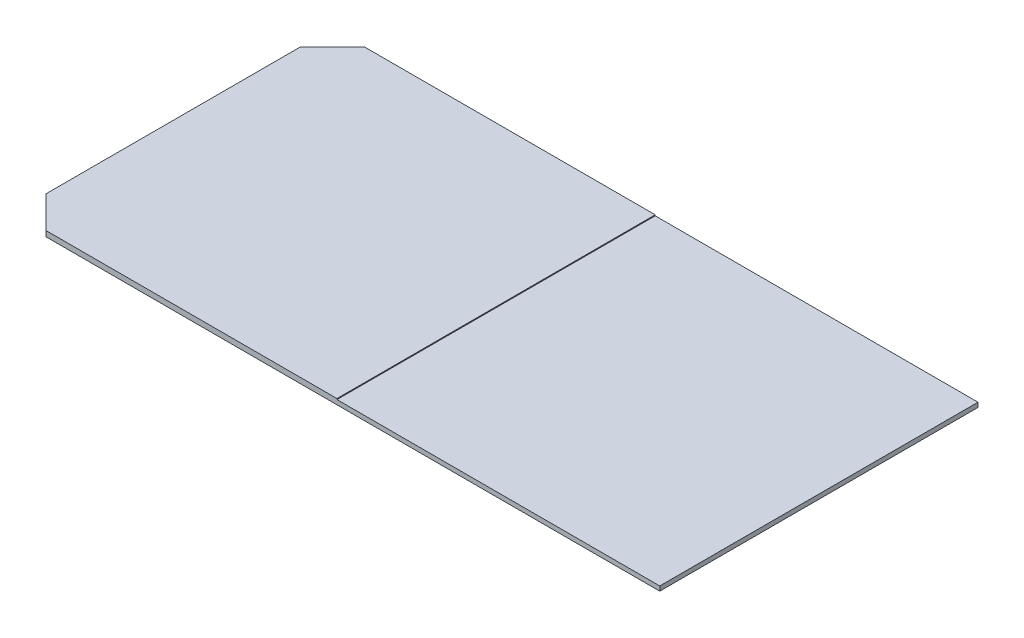
ISO-10303-21;
HEADER;
FILE_DESCRIPTION(('STEP AP214'),'2;1');
FILE_NAME('part.step','',(''),(''),'','','');
FILE_SCHEMA(('AUTOMOTIVE_DESIGN { 1 0 10303 214 1 1 1 1 }'));
ENDSEC;
DATA;
#1=APPLICATION_CONTEXT('core data for automotive mechanical design processes');
#2=APPLICATION_PROTOCOL_DEFINITION('international standard','automotive_design',2000,#1);
#3=PRODUCT_CONTEXT('',#1,'mechanical');
#4=PRODUCT('Part','Part','',(#3));
#5=PRODUCT_RELATED_PRODUCT_CATEGORY('part','',(#4));
#6=PRODUCT_DEFINITION_FORMATION('','',#4);
#7=PRODUCT_DEFINITION_CONTEXT('part definition',#1,'design');
#8=PRODUCT_DEFINITION('design','',#6,#7);
#9=PRODUCT_DEFINITION_SHAPE('','',#8);
#10=(LENGTH_UNIT() NAMED_UNIT(*) SI_UNIT(.MILLI.,.METRE.));
#11=(NAMED_UNIT(*) PLANE_ANGLE_UNIT() SI_UNIT($,.RADIAN.));
#12=(NAMED_UNIT(*) SI_UNIT($,.STERADIAN.) SOLID_ANGLE_UNIT());
#13=UNCERTAINTY_MEASURE_WITH_UNIT(LENGTH_MEASURE(1.E-05),#10,'distance_accuracy_value','');
#14=(GEOMETRIC_REPRESENTATION_CONTEXT(3) GLOBAL_UNCERTAINTY_ASSIGNED_CONTEXT((#13)) GLOBAL_UNIT_ASSIGNED_CONTEXT((#10,
#11,#12)) REPRESENTATION_CONTEXT('',''));
#15=CARTESIAN_POINT('',(0.,0.,0.));
#16=DIRECTION('',(0.,0.,1.));
#17=DIRECTION('',(1.,0.,0.));
#18=AXIS2_PLACEMENT_3D('',#15,#16,#17);
#19=CARTESIAN_POINT('',(0.,5.,0.));
#20=DIRECTION('',(1.,0.,0.));
#21=DIRECTION('',(0.,0.,-1.));
#22=AXIS2_PLACEMENT_3D('',#19,#20,#21);
#23=PLANE('',#22);
#24=DIRECTION('',(0.,0.,1.));
#25=VECTOR('',#24,1.);
#26=CARTESIAN_POINT('',(0.,6.,0.));
#27=LINE('',#26,#25);
#28=CARTESIAN_POINT('',(0.,6.,-315.));
#29=VERTEX_POINT('',#28);
#30=CARTESIAN_POINT('',(0.,6.,-35.));
#31=VERTEX_POINT('',#30);
#32=EDGE_CURVE('E119',#29,#31,#27,.T.);
#33=ORIENTED_EDGE('',*,*,#32,.F.);
#34=DIRECTION('',(0.,1.,0.));
#35=VECTOR('',#34,1.);
#36=CARTESIAN_POINT('',(0.,0.,-315.));
#37=LINE('',#36,#35);
#38=CARTESIAN_POINT('',(0.,0.,-315.));
#39=VERTEX_POINT('',#38);
#40=EDGE_CURVE('E63',#39,#29,#37,.T.);
#41=ORIENTED_EDGE('',*,*,#40,.F.);
#42=DIRECTION('',(0.,0.,1.));
#43=VECTOR('',#42,1.);
#44=CARTESIAN_POINT('',(0.,0.,0.));
#45=LINE('',#44,#43);
#46=CARTESIAN_POINT('',(0.,0.,-35.));
#47=VERTEX_POINT('',#46);
#48=EDGE_CURVE('E117',#39,#47,#45,.T.);
#49=ORIENTED_EDGE('',*,*,#48,.T.);
#50=DIRECTION('',(0.,1.,0.));
#51=VECTOR('',#50,1.);
#52=CARTESIAN_POINT('',(0.,0.,-35.));
#53=LINE('',#52,#51);
#54=EDGE_CURVE('E162',#47,#31,#53,.T.);
#55=ORIENTED_EDGE('',*,*,#54,.T.);
#56=EDGE_LOOP('',(#33,#41,#49,#55));
#57=FACE_BOUND('',#56,.T.);
#58=ADVANCED_FACE('F41',(#57),#23,.F.);
#59=CARTESIAN_POINT('',(0.,5.,0.));
#60=DIRECTION('',(0.,0.,-1.));
#61=DIRECTION('',(-1.,0.,0.));
#62=AXIS2_PLACEMENT_3D('',#59,#60,#61);
#63=PLANE('',#62);
#64=DIRECTION('',(0.,1.,0.));
#65=VECTOR('',#64,1.);
#66=CARTESIAN_POINT('',(34.9999999999997,0.,0.));
#67=LINE('',#66,#65);
#68=CARTESIAN_POINT('',(34.9999999999997,0.,0.));
#69=VERTEX_POINT('',#68);
#70=CARTESIAN_POINT('',(34.9999999999997,6.,0.));
#71=VERTEX_POINT('',#70);
#72=EDGE_CURVE('E55',#69,#71,#67,.T.);
#73=ORIENTED_EDGE('',*,*,#72,.F.);
#74=DIRECTION('',(1.,0.,0.));
#75=VECTOR('',#74,1.);
#76=CARTESIAN_POINT('',(0.,0.,0.));
#77=LINE('',#76,#75);
#78=CARTESIAN_POINT('',(710.,0.,0.));
#79=VERTEX_POINT('',#78);
#80=EDGE_CURVE('E125',#69,#79,#77,.T.);
#81=ORIENTED_EDGE('',*,*,#80,.T.);
#82=DIRECTION('',(0.,-1.,0.));
#83=VECTOR('',#82,1.);
#84=CARTESIAN_POINT('',(710.,5.,0.));
#85=LINE('',#84,#83);
#86=CARTESIAN_POINT('',(710.,5.,0.));
#87=VERTEX_POINT('',#86);
#88=EDGE_CURVE('E11',#87,#79,#85,.T.);
#89=ORIENTED_EDGE('',*,*,#88,.F.);
#90=DIRECTION('',(1.,0.,0.));
#91=VECTOR('',#90,1.);
#92=CARTESIAN_POINT('',(0.,5.,0.));
#93=LINE('',#92,#91);
#94=CARTESIAN_POINT('',(355.,5.,0.));
#95=VERTEX_POINT('',#94);
#96=EDGE_CURVE('E138',#95,#87,#93,.T.);
#97=ORIENTED_EDGE('',*,*,#96,.F.);
#98=DIRECTION('',(0.,-1.,0.));
#99=VECTOR('',#98,1.);
#100=CARTESIAN_POINT('',(355.,6.,0.));
#101=LINE('',#100,#99);
#102=CARTESIAN_POINT('',(355.,6.,0.));
#103=VERTEX_POINT('',#102);
#104=EDGE_CURVE('E130',#103,#95,#101,.T.);
#105=ORIENTED_EDGE('',*,*,#104,.F.);
#106=DIRECTION('',(1.,0.,0.));
#107=VECTOR('',#106,1.);
#108=CARTESIAN_POINT('',(0.,6.,0.));
#109=LINE('',#108,#107);
#110=EDGE_CURVE('E151',#71,#103,#109,.T.);
#111=ORIENTED_EDGE('',*,*,#110,.F.);
#112=EDGE_LOOP('',(#73,#81,#89,#97,#105,#111));
#113=FACE_BOUND('',#112,.T.);
#114=ADVANCED_FACE('F183',(#113),#63,.F.);
#115=CARTESIAN_POINT('',(0.,0.,0.));
#116=DIRECTION('',(0.,-1.,0.));
#117=DIRECTION('',(0.,0.,-1.));
#118=AXIS2_PLACEMENT_3D('',#115,#116,#117);
#119=PLANE('',#118);
#120=DIRECTION('',(0.707106781186544,0.,-0.707106781186551));
#121=VECTOR('',#120,1.);
#122=CARTESIAN_POINT('',(-157.5,0.,-157.499999999998));
#123=LINE('',#122,#121);
#124=CARTESIAN_POINT('',(34.9999999999996,0.,-350.));
#125=VERTEX_POINT('',#124);
#126=EDGE_CURVE('E103',#39,#125,#123,.T.);
#127=ORIENTED_EDGE('',*,*,#126,.T.);
#128=DIRECTION('',(-1.,0.,0.));
#129=VECTOR('',#128,1.);
#130=CARTESIAN_POINT('',(0.,0.,-350.));
#131=LINE('',#130,#129);
#132=CARTESIAN_POINT('',(710.,0.,-350.));
#133=VERTEX_POINT('',#132);
#134=EDGE_CURVE('E137',#133,#125,#131,.T.);
#135=ORIENTED_EDGE('',*,*,#134,.F.);
#136=DIRECTION('',(0.,0.,-1.));
#137=VECTOR('',#136,1.);
#138=CARTESIAN_POINT('',(710.,0.,0.));
#139=LINE('',#138,#137);
#140=EDGE_CURVE('E128',#79,#133,#139,.T.);
#141=ORIENTED_EDGE('',*,*,#140,.F.);
#142=ORIENTED_EDGE('',*,*,#80,.F.);
#143=DIRECTION('',(0.707106781186544,0.,0.707106781186551));
#144=VECTOR('',#143,1.);
#145=CARTESIAN_POINT('',(17.5,0.,-17.4999999999998));
#146=LINE('',#145,#144);
#147=EDGE_CURVE('E124',#47,#69,#146,.T.);
#148=ORIENTED_EDGE('',*,*,#147,.F.);
#149=ORIENTED_EDGE('',*,*,#48,.F.);
#150=EDGE_LOOP('',(#127,#135,#141,#142,#148,#149));
#151=FACE_BOUND('',#150,.T.);
#152=ADVANCED_FACE('F122',(#151),#119,.T.);
#153=CARTESIAN_POINT('',(0.,6.,0.));
#154=DIRECTION('',(0.,1.,0.));
#155=DIRECTION('',(0.,0.,1.));
#156=AXIS2_PLACEMENT_3D('',#153,#154,#155);
#157=PLANE('',#156);
#158=DIRECTION('',(0.707106781186544,0.,-0.707106781186551));
#159=VECTOR('',#158,1.);
#160=CARTESIAN_POINT('',(-157.5,6.,-157.499999999998));
#161=LINE('',#160,#159);
#162=CARTESIAN_POINT('',(34.9999999999996,6.,-350.));
#163=VERTEX_POINT('',#162);
#164=EDGE_CURVE('E111',#29,#163,#161,.T.);
#165=ORIENTED_EDGE('',*,*,#164,.F.);
#166=ORIENTED_EDGE('',*,*,#32,.T.);
#167=DIRECTION('',(0.707106781186544,0.,0.707106781186551));
#168=VECTOR('',#167,1.);
#169=CARTESIAN_POINT('',(17.5,6.,-17.4999999999998));
#170=LINE('',#169,#168);
#171=EDGE_CURVE('E165',#31,#71,#170,.T.);
#172=ORIENTED_EDGE('',*,*,#171,.T.);
#173=ORIENTED_EDGE('',*,*,#110,.T.);
#174=DIRECTION('',(0.,0.,1.));
#175=VECTOR('',#174,1.);
#176=CARTESIAN_POINT('',(355.,6.,0.));
#177=LINE('',#176,#175);
#178=CARTESIAN_POINT('',(355.,6.,-350.));
#179=VERTEX_POINT('',#178);
#180=EDGE_CURVE('E154',#179,#103,#177,.T.);
#181=ORIENTED_EDGE('',*,*,#180,.F.);
#182=DIRECTION('',(-1.,0.,0.));
#183=VECTOR('',#182,1.);
#184=CARTESIAN_POINT('',(0.,6.,-350.));
#185=LINE('',#184,#183);
#186=EDGE_CURVE('E157',#179,#163,#185,.T.);
#187=ORIENTED_EDGE('',*,*,#186,.T.);
#188=EDGE_LOOP('',(#165,#166,#172,#173,#181,#187));
#189=FACE_BOUND('',#188,.T.);
#190=ADVANCED_FACE('F173',(#189),#157,.T.);
#191=CARTESIAN_POINT('',(710.,5.,0.));
#192=DIRECTION('',(-1.,0.,0.));
#193=DIRECTION('',(0.,0.,1.));
#194=AXIS2_PLACEMENT_3D('',#191,#192,#193);
#195=PLANE('',#194);
#196=ORIENTED_EDGE('',*,*,#140,.T.);
#197=DIRECTION('',(0.,-1.,0.));
#198=VECTOR('',#197,1.);
#199=CARTESIAN_POINT('',(710.,5.,-350.));
#200=LINE('',#199,#198);
#201=CARTESIAN_POINT('',(710.,5.,-350.));
#202=VERTEX_POINT('',#201);
#203=EDGE_CURVE('E48',#202,#133,#200,.T.);
#204=ORIENTED_EDGE('',*,*,#203,.F.);
#205=DIRECTION('',(0.,0.,-1.));
#206=VECTOR('',#205,1.);
#207=CARTESIAN_POINT('',(710.,5.,0.));
#208=LINE('',#207,#206);
#209=EDGE_CURVE('E144',#87,#202,#208,.T.);
#210=ORIENTED_EDGE('',*,*,#209,.F.);
#211=ORIENTED_EDGE('',*,*,#88,.T.);
#212=EDGE_LOOP('',(#196,#204,#210,#211));
#213=FACE_BOUND('',#212,.T.);
#214=ADVANCED_FACE('F186',(#213),#195,.F.);
#215=CARTESIAN_POINT('',(0.,5.,-350.));
#216=DIRECTION('',(0.,0.,1.));
#217=DIRECTION('',(1.,0.,0.));
#218=AXIS2_PLACEMENT_3D('',#215,#216,#217);
#219=PLANE('',#218);
#220=ORIENTED_EDGE('',*,*,#134,.T.);
#221=DIRECTION('',(0.,1.,0.));
#222=VECTOR('',#221,1.);
#223=CARTESIAN_POINT('',(34.9999999999996,0.,-350.));
#224=LINE('',#223,#222);
#225=EDGE_CURVE('E106',#125,#163,#224,.T.);
#226=ORIENTED_EDGE('',*,*,#225,.T.);
#227=ORIENTED_EDGE('',*,*,#186,.F.);
#228=DIRECTION('',(0.,-1.,0.));
#229=VECTOR('',#228,1.);
#230=CARTESIAN_POINT('',(355.,6.,-350.));
#231=LINE('',#230,#229);
#232=CARTESIAN_POINT('',(355.,5.,-350.));
#233=VERTEX_POINT('',#232);
#234=EDGE_CURVE('E126',#179,#233,#231,.T.);
#235=ORIENTED_EDGE('',*,*,#234,.T.);
#236=DIRECTION('',(-1.,0.,0.));
#237=VECTOR('',#236,1.);
#238=CARTESIAN_POINT('',(0.,5.,-350.));
#239=LINE('',#238,#237);
#240=EDGE_CURVE('E133',#202,#233,#239,.T.);
#241=ORIENTED_EDGE('',*,*,#240,.F.);
#242=ORIENTED_EDGE('',*,*,#203,.T.);
#243=EDGE_LOOP('',(#220,#226,#227,#235,#241,#242));
#244=FACE_BOUND('',#243,.T.);
#245=ADVANCED_FACE('F171',(#244),#219,.F.);
#246=CARTESIAN_POINT('',(0.,5.,0.));
#247=DIRECTION('',(0.,-1.,0.));
#248=DIRECTION('',(0.,0.,-1.));
#249=AXIS2_PLACEMENT_3D('',#246,#247,#248);
#250=PLANE('',#249);
#251=ORIENTED_EDGE('',*,*,#240,.T.);
#252=DIRECTION('',(0.,0.,1.));
#253=VECTOR('',#252,1.);
#254=CARTESIAN_POINT('',(355.,5.,0.));
#255=LINE('',#254,#253);
#256=EDGE_CURVE('E152',#233,#95,#255,.T.);
#257=ORIENTED_EDGE('',*,*,#256,.T.);
#258=ORIENTED_EDGE('',*,*,#96,.T.);
#259=ORIENTED_EDGE('',*,*,#209,.T.);
#260=EDGE_LOOP('',(#251,#257,#258,#259));
#261=FACE_BOUND('',#260,.T.);
#262=ADVANCED_FACE('F180',(#261),#250,.F.);
#263=CARTESIAN_POINT('',(355.,6.,0.));
#264=DIRECTION('',(1.,0.,0.));
#265=DIRECTION('',(0.,0.,-1.));
#266=AXIS2_PLACEMENT_3D('',#263,#264,#265);
#267=PLANE('',#266);
#268=ORIENTED_EDGE('',*,*,#256,.F.);
#269=ORIENTED_EDGE('',*,*,#234,.F.);
#270=ORIENTED_EDGE('',*,*,#180,.T.);
#271=ORIENTED_EDGE('',*,*,#104,.T.);
#272=EDGE_LOOP('',(#268,#269,#270,#271));
#273=FACE_BOUND('',#272,.T.);
#274=ADVANCED_FACE('F178',(#273),#267,.T.);
#275=CARTESIAN_POINT('',(17.5,0.,-17.4999999999998));
#276=DIRECTION('',(-0.707106781186551,0.,0.707106781186544));
#277=DIRECTION('',(0.707106781186544,0.,0.707106781186551));
#278=AXIS2_PLACEMENT_3D('',#275,#276,#277);
#279=PLANE('',#278);
#280=ORIENTED_EDGE('',*,*,#171,.F.);
#281=ORIENTED_EDGE('',*,*,#54,.F.);
#282=ORIENTED_EDGE('',*,*,#147,.T.);
#283=ORIENTED_EDGE('',*,*,#72,.T.);
#284=EDGE_LOOP('',(#280,#281,#282,#283));
#285=FACE_BOUND('',#284,.T.);
#286=ADVANCED_FACE('F209',(#285),#279,.T.);
#287=CARTESIAN_POINT('',(-157.5,0.,-157.499999999998));
#288=DIRECTION('',(0.707106781186551,0.,0.707106781186544));
#289=DIRECTION('',(0.707106781186544,0.,-0.707106781186551));
#290=AXIS2_PLACEMENT_3D('',#287,#288,#289);
#291=PLANE('',#290);
#292=ORIENTED_EDGE('',*,*,#164,.T.);
#293=ORIENTED_EDGE('',*,*,#225,.F.);
#294=ORIENTED_EDGE('',*,*,#126,.F.);
#295=ORIENTED_EDGE('',*,*,#40,.T.);
#296=EDGE_LOOP('',(#292,#293,#294,#295));
#297=FACE_BOUND('',#296,.T.);
#298=ADVANCED_FACE('F104',(#297),#291,.F.);
#299=CLOSED_SHELL('',(#58,#114,#152,#190,#214,#245,#262,#274,#286,#298));
#300=MANIFOLD_SOLID_BREP('B2',#299);
#301=ADVANCED_BREP_SHAPE_REPRESENTATION('',(#18,#300),#14);
#302=SHAPE_DEFINITION_REPRESENTATION(#9,#301);
ENDSEC;
END-ISO-10303-21;
